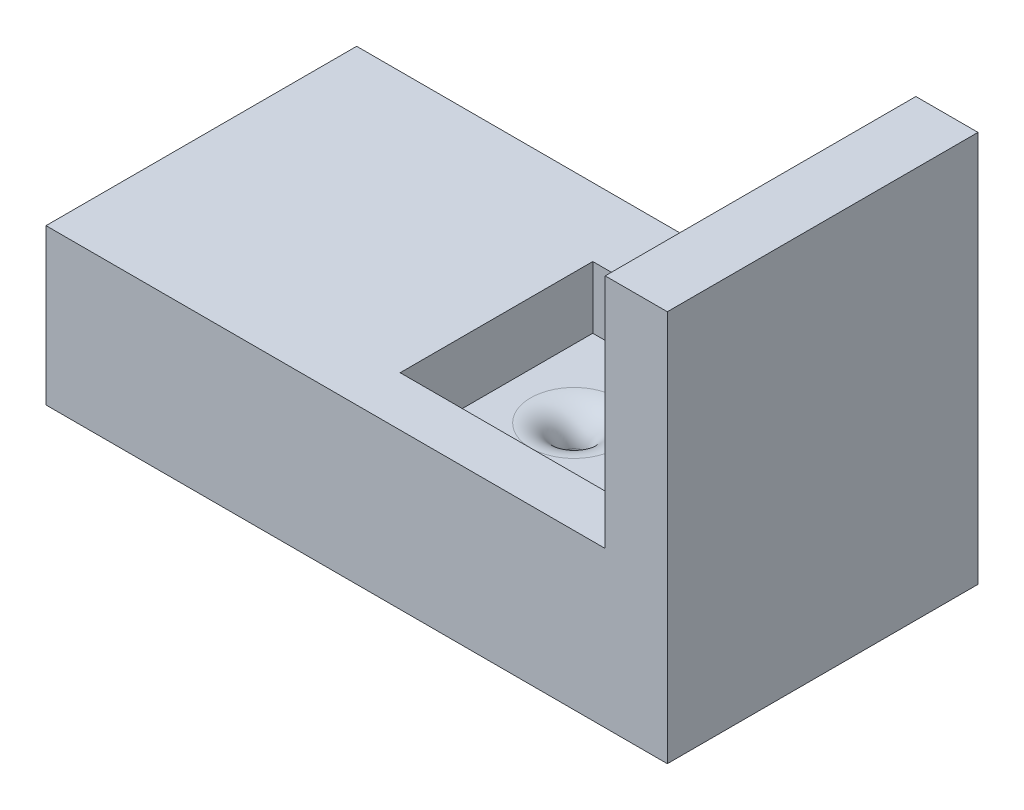
ISO-10303-21;
HEADER;
FILE_DESCRIPTION(('STEP AP214'),'2;1');
FILE_NAME('part.step','',(''),(''),'','','');
FILE_SCHEMA(('AUTOMOTIVE_DESIGN { 1 0 10303 214 1 1 1 1 }'));
ENDSEC;
DATA;
#1=APPLICATION_CONTEXT('core data for automotive mechanical design processes');
#2=APPLICATION_PROTOCOL_DEFINITION('international standard','automotive_design',2000,#1);
#3=PRODUCT_CONTEXT('',#1,'mechanical');
#4=PRODUCT('Part','Part','',(#3));
#5=PRODUCT_RELATED_PRODUCT_CATEGORY('part','',(#4));
#6=PRODUCT_DEFINITION_FORMATION('','',#4);
#7=PRODUCT_DEFINITION_CONTEXT('part definition',#1,'design');
#8=PRODUCT_DEFINITION('design','',#6,#7);
#9=PRODUCT_DEFINITION_SHAPE('','',#8);
#10=(LENGTH_UNIT() NAMED_UNIT(*) SI_UNIT(.MILLI.,.METRE.));
#11=(NAMED_UNIT(*) PLANE_ANGLE_UNIT() SI_UNIT($,.RADIAN.));
#12=(NAMED_UNIT(*) SI_UNIT($,.STERADIAN.) SOLID_ANGLE_UNIT());
#13=UNCERTAINTY_MEASURE_WITH_UNIT(LENGTH_MEASURE(1.E-05),#10,'distance_accuracy_value','');
#14=(GEOMETRIC_REPRESENTATION_CONTEXT(3) GLOBAL_UNCERTAINTY_ASSIGNED_CONTEXT((#13)) GLOBAL_UNIT_ASSIGNED_CONTEXT((#10,
#11,#12)) REPRESENTATION_CONTEXT('',''));
#15=CARTESIAN_POINT('',(0.,0.,0.));
#16=DIRECTION('',(0.,0.,1.));
#17=DIRECTION('',(1.,0.,0.));
#18=AXIS2_PLACEMENT_3D('',#15,#16,#17);
#19=CARTESIAN_POINT('',(0.,-5.,0.));
#20=DIRECTION('',(0.,-1.,0.));
#21=DIRECTION('',(0.,0.,-1.));
#22=AXIS2_PLACEMENT_3D('',#19,#20,#21);
#23=PLANE('',#22);
#24=CARTESIAN_POINT('',(30.,-5.,0.));
#25=DIRECTION('',(0.,-1.,0.));
#26=DIRECTION('',(0.,0.,-1.));
#27=AXIS2_PLACEMENT_3D('',#24,#25,#26);
#28=CIRCLE('',#27,5.8);
#29=CARTESIAN_POINT('',(30.,-5.,-5.8));
#30=VERTEX_POINT('',#29);
#31=EDGE_CURVE('E216',#30,#30,#28,.F.);
#32=ORIENTED_EDGE('',*,*,#31,.T.);
#33=EDGE_LOOP('',(#32));
#34=FACE_BOUND('',#33,.T.);
#35=CARTESIAN_POINT('',(30.,-5.,0.));
#36=DIRECTION('',(0.,-1.,0.));
#37=DIRECTION('',(0.,0.,-1.));
#38=AXIS2_PLACEMENT_3D('',#35,#36,#37);
#39=CIRCLE('',#38,5.99999999999999);
#40=CARTESIAN_POINT('',(30.,-5.,-5.99999999999999));
#41=VERTEX_POINT('',#40);
#42=EDGE_CURVE('E222',#41,#41,#39,.F.);
#43=ORIENTED_EDGE('',*,*,#42,.F.);
#44=EDGE_LOOP('',(#43));
#45=FACE_BOUND('',#44,.T.);
#46=ADVANCED_FACE('F33',(#34,#45),#23,.T.);
#47=CARTESIAN_POINT('',(0.,10.,0.));
#48=DIRECTION('',(0.,1.,0.));
#49=DIRECTION('',(0.,0.,1.));
#50=AXIS2_PLACEMENT_3D('',#47,#48,#49);
#51=PLANE('',#50);
#52=DIRECTION('',(0.,0.,1.));
#53=VECTOR('',#52,1.);
#54=CARTESIAN_POINT('',(60.,10.,-25.));
#55=LINE('',#54,#53);
#56=CARTESIAN_POINT('',(60.,10.,-25.));
#57=VERTEX_POINT('',#56);
#58=CARTESIAN_POINT('',(60.,10.,-14.));
#59=VERTEX_POINT('',#58);
#60=EDGE_CURVE('E48',#57,#59,#55,.T.);
#61=ORIENTED_EDGE('',*,*,#60,.F.);
#62=DIRECTION('',(-1.,0.,0.));
#63=VECTOR('',#62,1.);
#64=CARTESIAN_POINT('',(70.,10.,-25.));
#65=LINE('',#64,#63);
#66=CARTESIAN_POINT('',(-30.,10.,-25.));
#67=VERTEX_POINT('',#66);
#68=EDGE_CURVE('E122',#57,#67,#65,.T.);
#69=ORIENTED_EDGE('',*,*,#68,.T.);
#70=DIRECTION('',(0.,0.,1.));
#71=VECTOR('',#70,1.);
#72=CARTESIAN_POINT('',(-30.,10.,-25.));
#73=LINE('',#72,#71);
#74=CARTESIAN_POINT('',(-30.,10.,25.));
#75=VERTEX_POINT('',#74);
#76=EDGE_CURVE('E119',#67,#75,#73,.T.);
#77=ORIENTED_EDGE('',*,*,#76,.T.);
#78=DIRECTION('',(1.,0.,0.));
#79=VECTOR('',#78,1.);
#80=CARTESIAN_POINT('',(-30.,10.,25.));
#81=LINE('',#80,#79);
#82=CARTESIAN_POINT('',(60.,10.,25.));
#83=VERTEX_POINT('',#82);
#84=EDGE_CURVE('E193',#75,#83,#81,.T.);
#85=ORIENTED_EDGE('',*,*,#84,.T.);
#86=CARTESIAN_POINT('',(60.,10.,17.));
#87=VERTEX_POINT('',#86);
#88=EDGE_CURVE('E55',#87,#83,#55,.T.);
#89=ORIENTED_EDGE('',*,*,#88,.F.);
#90=DIRECTION('',(1.,0.,0.));
#91=VECTOR('',#90,1.);
#92=CARTESIAN_POINT('',(60.,10.,17.));
#93=LINE('',#92,#91);
#94=CARTESIAN_POINT('',(19.,10.,17.));
#95=VERTEX_POINT('',#94);
#96=EDGE_CURVE('E173',#95,#87,#93,.T.);
#97=ORIENTED_EDGE('',*,*,#96,.F.);
#98=DIRECTION('',(0.,0.,1.));
#99=VECTOR('',#98,1.);
#100=CARTESIAN_POINT('',(19.,10.,-14.));
#101=LINE('',#100,#99);
#102=CARTESIAN_POINT('',(19.,10.,-14.));
#103=VERTEX_POINT('',#102);
#104=EDGE_CURVE('E171',#103,#95,#101,.T.);
#105=ORIENTED_EDGE('',*,*,#104,.F.);
#106=DIRECTION('',(-1.,0.,0.));
#107=VECTOR('',#106,1.);
#108=CARTESIAN_POINT('',(60.,10.,-14.));
#109=LINE('',#108,#107);
#110=EDGE_CURVE('E174',#59,#103,#109,.T.);
#111=ORIENTED_EDGE('',*,*,#110,.F.);
#112=EDGE_LOOP('',(#61,#69,#77,#85,#89,#97,#105,#111));
#113=FACE_BOUND('',#112,.T.);
#114=ADVANCED_FACE('F201',(#113),#51,.T.);
#115=CARTESIAN_POINT('',(-30.,10.,-25.));
#116=DIRECTION('',(1.,0.,0.));
#117=DIRECTION('',(0.,0.,-1.));
#118=AXIS2_PLACEMENT_3D('',#115,#116,#117);
#119=PLANE('',#118);
#120=DIRECTION('',(0.,-1.,0.));
#121=VECTOR('',#120,1.);
#122=CARTESIAN_POINT('',(-30.,10.,-25.));
#123=LINE('',#122,#121);
#124=CARTESIAN_POINT('',(-30.,-15.,-25.));
#125=VERTEX_POINT('',#124);
#126=EDGE_CURVE('E112',#67,#125,#123,.T.);
#127=ORIENTED_EDGE('',*,*,#126,.T.);
#128=DIRECTION('',(0.,0.,-1.));
#129=VECTOR('',#128,1.);
#130=CARTESIAN_POINT('',(-30.,-15.,25.));
#131=LINE('',#130,#129);
#132=CARTESIAN_POINT('',(-30.,-15.,25.));
#133=VERTEX_POINT('',#132);
#134=EDGE_CURVE('E117',#133,#125,#131,.T.);
#135=ORIENTED_EDGE('',*,*,#134,.F.);
#136=DIRECTION('',(0.,-1.,0.));
#137=VECTOR('',#136,1.);
#138=CARTESIAN_POINT('',(-30.,10.,25.));
#139=LINE('',#138,#137);
#140=EDGE_CURVE('E199',#75,#133,#139,.T.);
#141=ORIENTED_EDGE('',*,*,#140,.F.);
#142=ORIENTED_EDGE('',*,*,#76,.F.);
#143=EDGE_LOOP('',(#127,#135,#141,#142));
#144=FACE_BOUND('',#143,.T.);
#145=ADVANCED_FACE('F114',(#144),#119,.F.);
#146=CARTESIAN_POINT('',(-30.,10.,25.));
#147=DIRECTION('',(0.,0.,-1.));
#148=DIRECTION('',(-1.,0.,0.));
#149=AXIS2_PLACEMENT_3D('',#146,#147,#148);
#150=PLANE('',#149);
#151=ORIENTED_EDGE('',*,*,#140,.T.);
#152=DIRECTION('',(-1.,0.,0.));
#153=VECTOR('',#152,1.);
#154=CARTESIAN_POINT('',(-30.,-15.,25.));
#155=LINE('',#154,#153);
#156=CARTESIAN_POINT('',(70.,-15.,25.));
#157=VERTEX_POINT('',#156);
#158=EDGE_CURVE('E137',#157,#133,#155,.T.);
#159=ORIENTED_EDGE('',*,*,#158,.F.);
#160=DIRECTION('',(0.,-1.,0.));
#161=VECTOR('',#160,1.);
#162=CARTESIAN_POINT('',(70.,10.,25.));
#163=LINE('',#162,#161);
#164=CARTESIAN_POINT('',(70.,48.,25.));
#165=VERTEX_POINT('',#164);
#166=EDGE_CURVE('E454',#165,#157,#163,.T.);
#167=ORIENTED_EDGE('',*,*,#166,.F.);
#168=DIRECTION('',(-1.,0.,0.));
#169=VECTOR('',#168,1.);
#170=CARTESIAN_POINT('',(70.,48.,25.));
#171=LINE('',#170,#169);
#172=CARTESIAN_POINT('',(60.,48.,25.));
#173=VERTEX_POINT('',#172);
#174=EDGE_CURVE('E151',#165,#173,#171,.T.);
#175=ORIENTED_EDGE('',*,*,#174,.T.);
#176=DIRECTION('',(0.,-1.,0.));
#177=VECTOR('',#176,1.);
#178=CARTESIAN_POINT('',(60.,10.,25.));
#179=LINE('',#178,#177);
#180=EDGE_CURVE('E156',#173,#83,#179,.T.);
#181=ORIENTED_EDGE('',*,*,#180,.T.);
#182=ORIENTED_EDGE('',*,*,#84,.F.);
#183=EDGE_LOOP('',(#151,#159,#167,#175,#181,#182));
#184=FACE_BOUND('',#183,.T.);
#185=ADVANCED_FACE('F276',(#184),#150,.F.);
#186=CARTESIAN_POINT('',(70.,10.,-25.));
#187=DIRECTION('',(-1.,0.,0.));
#188=DIRECTION('',(0.,0.,1.));
#189=AXIS2_PLACEMENT_3D('',#186,#187,#188);
#190=PLANE('',#189);
#191=ORIENTED_EDGE('',*,*,#166,.T.);
#192=DIRECTION('',(0.,0.,1.));
#193=VECTOR('',#192,1.);
#194=CARTESIAN_POINT('',(70.,-15.,25.));
#195=LINE('',#194,#193);
#196=CARTESIAN_POINT('',(70.,-15.,-25.));
#197=VERTEX_POINT('',#196);
#198=EDGE_CURVE('E131',#197,#157,#195,.T.);
#199=ORIENTED_EDGE('',*,*,#198,.F.);
#200=DIRECTION('',(0.,-1.,0.));
#201=VECTOR('',#200,1.);
#202=CARTESIAN_POINT('',(70.,10.,-25.));
#203=LINE('',#202,#201);
#204=CARTESIAN_POINT('',(70.,48.,-25.));
#205=VERTEX_POINT('',#204);
#206=EDGE_CURVE('E121',#205,#197,#203,.T.);
#207=ORIENTED_EDGE('',*,*,#206,.F.);
#208=DIRECTION('',(0.,0.,1.));
#209=VECTOR('',#208,1.);
#210=CARTESIAN_POINT('',(70.,48.,-25.));
#211=LINE('',#210,#209);
#212=EDGE_CURVE('E170',#205,#165,#211,.T.);
#213=ORIENTED_EDGE('',*,*,#212,.T.);
#214=EDGE_LOOP('',(#191,#199,#207,#213));
#215=FACE_BOUND('',#214,.T.);
#216=ADVANCED_FACE('F273',(#215),#190,.F.);
#217=CARTESIAN_POINT('',(70.,10.,-25.));
#218=DIRECTION('',(0.,0.,1.));
#219=DIRECTION('',(1.,0.,0.));
#220=AXIS2_PLACEMENT_3D('',#217,#218,#219);
#221=PLANE('',#220);
#222=ORIENTED_EDGE('',*,*,#206,.T.);
#223=DIRECTION('',(1.,0.,0.));
#224=VECTOR('',#223,1.);
#225=CARTESIAN_POINT('',(-30.,-15.,-25.));
#226=LINE('',#225,#224);
#227=EDGE_CURVE('E125',#125,#197,#226,.T.);
#228=ORIENTED_EDGE('',*,*,#227,.F.);
#229=ORIENTED_EDGE('',*,*,#126,.F.);
#230=ORIENTED_EDGE('',*,*,#68,.F.);
#231=DIRECTION('',(0.,-1.,0.));
#232=VECTOR('',#231,1.);
#233=CARTESIAN_POINT('',(60.,10.,-25.));
#234=LINE('',#233,#232);
#235=CARTESIAN_POINT('',(60.,48.,-25.));
#236=VERTEX_POINT('',#235);
#237=EDGE_CURVE('E155',#236,#57,#234,.T.);
#238=ORIENTED_EDGE('',*,*,#237,.F.);
#239=DIRECTION('',(-1.,0.,0.));
#240=VECTOR('',#239,1.);
#241=CARTESIAN_POINT('',(70.,48.,-25.));
#242=LINE('',#241,#240);
#243=EDGE_CURVE('E152',#205,#236,#242,.T.);
#244=ORIENTED_EDGE('',*,*,#243,.F.);
#245=EDGE_LOOP('',(#222,#228,#229,#230,#238,#244));
#246=FACE_BOUND('',#245,.T.);
#247=ADVANCED_FACE('F126',(#246),#221,.F.);
#248=CARTESIAN_POINT('',(60.,10.,-14.));
#249=DIRECTION('',(0.,0.,1.));
#250=DIRECTION('',(1.,0.,0.));
#251=AXIS2_PLACEMENT_3D('',#248,#249,#250);
#252=PLANE('',#251);
#253=DIRECTION('',(-1.,0.,0.));
#254=VECTOR('',#253,1.);
#255=CARTESIAN_POINT('',(60.,0.,-14.));
#256=LINE('',#255,#254);
#257=CARTESIAN_POINT('',(60.,0.,-14.));
#258=VERTEX_POINT('',#257);
#259=CARTESIAN_POINT('',(19.,0.,-14.));
#260=VERTEX_POINT('',#259);
#261=EDGE_CURVE('E169',#258,#260,#256,.T.);
#262=ORIENTED_EDGE('',*,*,#261,.F.);
#263=DIRECTION('',(0.,-1.,0.));
#264=VECTOR('',#263,1.);
#265=CARTESIAN_POINT('',(60.,10.,-14.));
#266=LINE('',#265,#264);
#267=EDGE_CURVE('E462',#59,#258,#266,.T.);
#268=ORIENTED_EDGE('',*,*,#267,.F.);
#269=ORIENTED_EDGE('',*,*,#110,.T.);
#270=DIRECTION('',(0.,-1.,0.));
#271=VECTOR('',#270,1.);
#272=CARTESIAN_POINT('',(19.,10.,-14.));
#273=LINE('',#272,#271);
#274=EDGE_CURVE('E188',#103,#260,#273,.T.);
#275=ORIENTED_EDGE('',*,*,#274,.T.);
#276=EDGE_LOOP('',(#262,#268,#269,#275));
#277=FACE_BOUND('',#276,.T.);
#278=ADVANCED_FACE('F266',(#277),#252,.T.);
#279=CARTESIAN_POINT('',(19.,10.,-14.));
#280=DIRECTION('',(1.,0.,0.));
#281=DIRECTION('',(0.,0.,-1.));
#282=AXIS2_PLACEMENT_3D('',#279,#280,#281);
#283=PLANE('',#282);
#284=DIRECTION('',(0.,0.,1.));
#285=VECTOR('',#284,1.);
#286=CARTESIAN_POINT('',(19.,0.,-14.));
#287=LINE('',#286,#285);
#288=CARTESIAN_POINT('',(19.,0.,17.));
#289=VERTEX_POINT('',#288);
#290=EDGE_CURVE('E177',#260,#289,#287,.T.);
#291=ORIENTED_EDGE('',*,*,#290,.F.);
#292=ORIENTED_EDGE('',*,*,#274,.F.);
#293=ORIENTED_EDGE('',*,*,#104,.T.);
#294=DIRECTION('',(0.,-1.,0.));
#295=VECTOR('',#294,1.);
#296=CARTESIAN_POINT('',(19.,10.,17.));
#297=LINE('',#296,#295);
#298=EDGE_CURVE('E186',#95,#289,#297,.T.);
#299=ORIENTED_EDGE('',*,*,#298,.T.);
#300=EDGE_LOOP('',(#291,#292,#293,#299));
#301=FACE_BOUND('',#300,.T.);
#302=ADVANCED_FACE('F262',(#301),#283,.T.);
#303=CARTESIAN_POINT('',(60.,10.,17.));
#304=DIRECTION('',(0.,0.,-1.));
#305=DIRECTION('',(-1.,0.,0.));
#306=AXIS2_PLACEMENT_3D('',#303,#304,#305);
#307=PLANE('',#306);
#308=DIRECTION('',(1.,0.,0.));
#309=VECTOR('',#308,1.);
#310=CARTESIAN_POINT('',(60.,0.,17.));
#311=LINE('',#310,#309);
#312=CARTESIAN_POINT('',(60.,0.,17.));
#313=VERTEX_POINT('',#312);
#314=EDGE_CURVE('E180',#289,#313,#311,.T.);
#315=ORIENTED_EDGE('',*,*,#314,.F.);
#316=ORIENTED_EDGE('',*,*,#298,.F.);
#317=ORIENTED_EDGE('',*,*,#96,.T.);
#318=DIRECTION('',(0.,-1.,0.));
#319=VECTOR('',#318,1.);
#320=CARTESIAN_POINT('',(60.,10.,17.));
#321=LINE('',#320,#319);
#322=EDGE_CURVE('E189',#87,#313,#321,.T.);
#323=ORIENTED_EDGE('',*,*,#322,.T.);
#324=EDGE_LOOP('',(#315,#316,#317,#323));
#325=FACE_BOUND('',#324,.T.);
#326=ADVANCED_FACE('F259',(#325),#307,.T.);
#327=CARTESIAN_POINT('',(60.,10.,-14.));
#328=DIRECTION('',(-1.,0.,0.));
#329=DIRECTION('',(0.,0.,1.));
#330=AXIS2_PLACEMENT_3D('',#327,#328,#329);
#331=PLANE('',#330);
#332=DIRECTION('',(0.,0.,-1.));
#333=VECTOR('',#332,1.);
#334=CARTESIAN_POINT('',(60.,0.,-14.));
#335=LINE('',#334,#333);
#336=EDGE_CURVE('E183',#313,#258,#335,.T.);
#337=ORIENTED_EDGE('',*,*,#336,.F.);
#338=ORIENTED_EDGE('',*,*,#322,.F.);
#339=ORIENTED_EDGE('',*,*,#88,.T.);
#340=ORIENTED_EDGE('',*,*,#180,.F.);
#341=DIRECTION('',(0.,0.,1.));
#342=VECTOR('',#341,1.);
#343=CARTESIAN_POINT('',(60.,48.,-25.));
#344=LINE('',#343,#342);
#345=EDGE_CURVE('E161',#236,#173,#344,.T.);
#346=ORIENTED_EDGE('',*,*,#345,.F.);
#347=ORIENTED_EDGE('',*,*,#237,.T.);
#348=ORIENTED_EDGE('',*,*,#60,.T.);
#349=ORIENTED_EDGE('',*,*,#267,.T.);
#350=EDGE_LOOP('',(#337,#338,#339,#340,#346,#347,#348,#349));
#351=FACE_BOUND('',#350,.T.);
#352=ADVANCED_FACE('F206',(#351),#331,.T.);
#353=CARTESIAN_POINT('',(70.,48.,-25.));
#354=DIRECTION('',(0.,1.,0.));
#355=DIRECTION('',(0.,0.,1.));
#356=AXIS2_PLACEMENT_3D('',#353,#354,#355);
#357=PLANE('',#356);
#358=ORIENTED_EDGE('',*,*,#174,.F.);
#359=ORIENTED_EDGE('',*,*,#212,.F.);
#360=ORIENTED_EDGE('',*,*,#243,.T.);
#361=ORIENTED_EDGE('',*,*,#345,.T.);
#362=EDGE_LOOP('',(#358,#359,#360,#361));
#363=FACE_BOUND('',#362,.T.);
#364=ADVANCED_FACE('F253',(#363),#357,.T.);
#365=CARTESIAN_POINT('',(0.,0.,0.));
#366=DIRECTION('',(0.,-1.,0.));
#367=DIRECTION('',(0.,0.,-1.));
#368=AXIS2_PLACEMENT_3D('',#365,#366,#367);
#369=PLANE('',#368);
#370=CARTESIAN_POINT('',(30.,0.,0.));
#371=DIRECTION('',(0.,-1.,0.));
#372=DIRECTION('',(0.,0.,-1.));
#373=AXIS2_PLACEMENT_3D('',#370,#371,#372);
#374=CIRCLE('',#373,7.00000000000001);
#375=CARTESIAN_POINT('',(30.,0.,-7.00000000000001));
#376=VERTEX_POINT('',#375);
#377=EDGE_CURVE('E41',#376,#376,#374,.T.);
#378=ORIENTED_EDGE('',*,*,#377,.T.);
#379=EDGE_LOOP('',(#378));
#380=FACE_BOUND('',#379,.T.);
#381=ORIENTED_EDGE('',*,*,#261,.T.);
#382=ORIENTED_EDGE('',*,*,#290,.T.);
#383=ORIENTED_EDGE('',*,*,#314,.T.);
#384=ORIENTED_EDGE('',*,*,#336,.T.);
#385=EDGE_LOOP('',(#381,#382,#383,#384));
#386=FACE_BOUND('',#385,.T.);
#387=ADVANCED_FACE('F227',(#380,#386),#369,.F.);
#388=CARTESIAN_POINT('',(30.,-5.,0.));
#389=DIRECTION('',(0.,1.,0.));
#390=DIRECTION('',(0.,0.,1.));
#391=AXIS2_PLACEMENT_3D('',#388,#389,#390);
#392=CYLINDRICAL_SURFACE('',#391,2.00000000000001);
#393=CARTESIAN_POINT('',(30.,-5.,0.));
#394=DIRECTION('',(0.,-1.,0.));
#395=DIRECTION('',(0.,0.,-1.));
#396=AXIS2_PLACEMENT_3D('',#393,#394,#395);
#397=CIRCLE('',#396,2.00000000000001);
#398=CARTESIAN_POINT('',(30.,-5.,-2.00000000000001));
#399=VERTEX_POINT('',#398);
#400=EDGE_CURVE('E11',#399,#399,#397,.F.);
#401=ORIENTED_EDGE('',*,*,#400,.T.);
#402=EDGE_LOOP('',(#401));
#403=FACE_BOUND('',#402,.T.);
#404=CARTESIAN_POINT('',(30.,-15.,0.));
#405=DIRECTION('',(0.,1.,0.));
#406=DIRECTION('',(0.,0.,1.));
#407=AXIS2_PLACEMENT_3D('',#404,#405,#406);
#408=CIRCLE('',#407,2.);
#409=CARTESIAN_POINT('',(30.,-15.,2.));
#410=VERTEX_POINT('',#409);
#411=EDGE_CURVE('E148',#410,#410,#408,.T.);
#412=ORIENTED_EDGE('',*,*,#411,.F.);
#413=EDGE_LOOP('',(#412));
#414=FACE_BOUND('',#413,.T.);
#415=ADVANCED_FACE('F249',(#403,#414),#392,.F.);
#416=CARTESIAN_POINT('',(32.,-15.,0.));
#417=DIRECTION('',(0.,1.,0.));
#418=DIRECTION('',(0.,0.,1.));
#419=AXIS2_PLACEMENT_3D('',#416,#417,#418);
#420=PLANE('',#419);
#421=CARTESIAN_POINT('',(30.,-15.,0.));
#422=DIRECTION('',(0.,1.,0.));
#423=DIRECTION('',(0.,0.,1.));
#424=AXIS2_PLACEMENT_3D('',#421,#422,#423);
#425=CIRCLE('',#424,3.8);
#426=CARTESIAN_POINT('',(30.,-15.,3.8));
#427=VERTEX_POINT('',#426);
#428=EDGE_CURVE('E145',#427,#427,#425,.T.);
#429=ORIENTED_EDGE('',*,*,#428,.F.);
#430=EDGE_LOOP('',(#429));
#431=FACE_BOUND('',#430,.T.);
#432=ORIENTED_EDGE('',*,*,#411,.T.);
#433=EDGE_LOOP('',(#432));
#434=FACE_BOUND('',#433,.T.);
#435=ADVANCED_FACE('F291',(#431,#434),#420,.F.);
#436=CARTESIAN_POINT('',(30.,-5.,0.));
#437=DIRECTION('',(0.,1.,0.));
#438=DIRECTION('',(0.,0.,1.));
#439=AXIS2_PLACEMENT_3D('',#436,#437,#438);
#440=CYLINDRICAL_SURFACE('',#439,3.8);
#441=CARTESIAN_POINT('',(30.,-7.,0.));
#442=DIRECTION('',(0.,-1.,0.));
#443=DIRECTION('',(0.,0.,-1.));
#444=AXIS2_PLACEMENT_3D('',#441,#442,#443);
#445=CIRCLE('',#444,3.8);
#446=CARTESIAN_POINT('',(30.,-7.,-3.8));
#447=VERTEX_POINT('',#446);
#448=EDGE_CURVE('E219',#447,#447,#445,.T.);
#449=ORIENTED_EDGE('',*,*,#448,.T.);
#450=EDGE_LOOP('',(#449));
#451=FACE_BOUND('',#450,.T.);
#452=ORIENTED_EDGE('',*,*,#428,.T.);
#453=EDGE_LOOP('',(#452));
#454=FACE_BOUND('',#453,.T.);
#455=ADVANCED_FACE('F284',(#451,#454),#440,.T.);
#456=CARTESIAN_POINT('',(30.,-7.,0.));
#457=DIRECTION('',(0.,-1.,0.));
#458=DIRECTION('',(0.,0.,-1.));
#459=AXIS2_PLACEMENT_3D('',#456,#457,#458);
#460=TOROIDAL_SURFACE('',#459,5.8,2.);
#461=ORIENTED_EDGE('',*,*,#448,.F.);
#462=EDGE_LOOP('',(#461));
#463=FACE_BOUND('',#462,.T.);
#464=ORIENTED_EDGE('',*,*,#31,.F.);
#465=EDGE_LOOP('',(#464));
#466=FACE_BOUND('',#465,.T.);
#467=ADVANCED_FACE('F282',(#463,#466),#460,.F.);
#468=CARTESIAN_POINT('',(0.,-15.,0.));
#469=DIRECTION('',(0.,-1.,0.));
#470=DIRECTION('',(0.,0.,-1.));
#471=AXIS2_PLACEMENT_3D('',#468,#469,#470);
#472=PLANE('',#471);
#473=ORIENTED_EDGE('',*,*,#134,.T.);
#474=ORIENTED_EDGE('',*,*,#227,.T.);
#475=ORIENTED_EDGE('',*,*,#198,.T.);
#476=ORIENTED_EDGE('',*,*,#158,.T.);
#477=EDGE_LOOP('',(#473,#474,#475,#476));
#478=FACE_BOUND('',#477,.T.);
#479=CARTESIAN_POINT('',(30.,-15.,0.));
#480=DIRECTION('',(0.,-1.,0.));
#481=DIRECTION('',(0.,0.,-1.));
#482=AXIS2_PLACEMENT_3D('',#479,#480,#481);
#483=CIRCLE('',#482,5.99999999999999);
#484=CARTESIAN_POINT('',(30.,-15.,-5.99999999999999));
#485=VERTEX_POINT('',#484);
#486=EDGE_CURVE('E138',#485,#485,#483,.T.);
#487=ORIENTED_EDGE('',*,*,#486,.F.);
#488=EDGE_LOOP('',(#487));
#489=FACE_BOUND('',#488,.T.);
#490=ADVANCED_FACE('F134',(#478,#489),#472,.T.);
#491=CARTESIAN_POINT('',(30.,-15.,0.));
#492=DIRECTION('',(0.,1.,0.));
#493=DIRECTION('',(0.,0.,1.));
#494=AXIS2_PLACEMENT_3D('',#491,#492,#493);
#495=CYLINDRICAL_SURFACE('',#494,5.99999999999999);
#496=ORIENTED_EDGE('',*,*,#486,.T.);
#497=EDGE_LOOP('',(#496));
#498=FACE_BOUND('',#497,.T.);
#499=ORIENTED_EDGE('',*,*,#42,.T.);
#500=EDGE_LOOP('',(#499));
#501=FACE_BOUND('',#500,.T.);
#502=ADVANCED_FACE('F231',(#498,#501),#495,.F.);
#503=CARTESIAN_POINT('',(30.,-5.,0.));
#504=DIRECTION('',(0.,-1.,0.));
#505=DIRECTION('',(0.,0.,-1.));
#506=AXIS2_PLACEMENT_3D('',#503,#504,#505);
#507=TOROIDAL_SURFACE('',#506,7.00000000000001,5.);
#508=ORIENTED_EDGE('',*,*,#400,.F.);
#509=EDGE_LOOP('',(#508));
#510=FACE_BOUND('',#509,.T.);
#511=ORIENTED_EDGE('',*,*,#377,.F.);
#512=EDGE_LOOP('',(#511));
#513=FACE_BOUND('',#512,.T.);
#514=ADVANCED_FACE('F35',(#510,#513),#507,.T.);
#515=CLOSED_SHELL('',(#46,#114,#145,#185,#216,#247,#278,#302,#326,#352,#364,#387,#415,#435,#455,
#467,#490,#502,#514));
#516=MANIFOLD_SOLID_BREP('B2',#515);
#517=ADVANCED_BREP_SHAPE_REPRESENTATION('',(#18,#516),#14);
#518=SHAPE_DEFINITION_REPRESENTATION(#9,#517);
ENDSEC;
END-ISO-10303-21;
